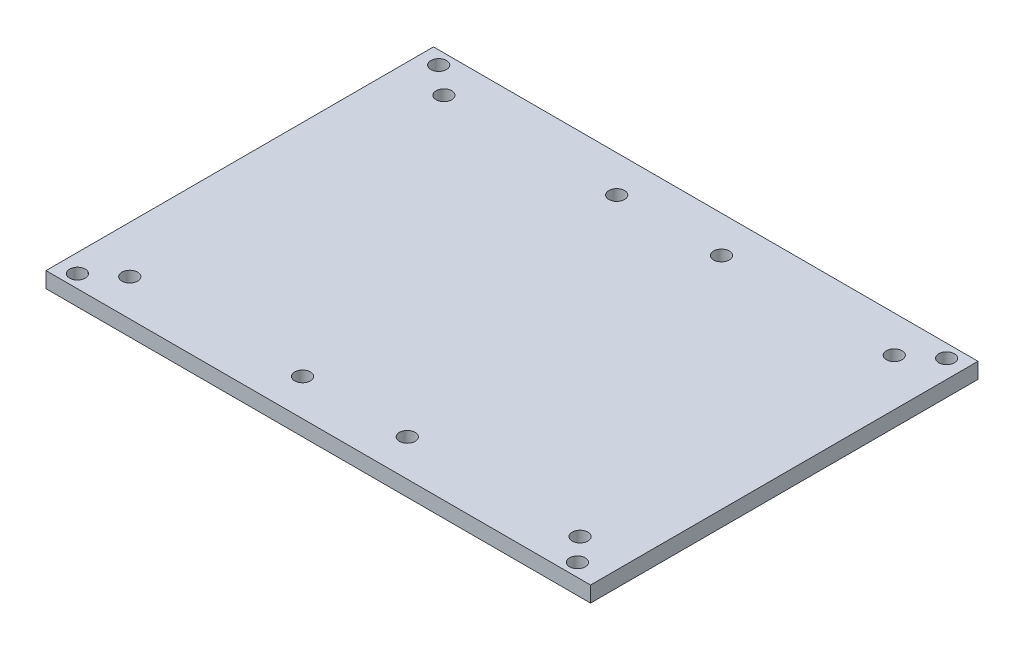
ISO-10303-21;
HEADER;
FILE_DESCRIPTION(('STEP AP214'),'2;1');
FILE_NAME('part.step','',(''),(''),'','','');
FILE_SCHEMA(('AUTOMOTIVE_DESIGN { 1 0 10303 214 1 1 1 1 }'));
ENDSEC;
DATA;
#1=APPLICATION_CONTEXT('core data for automotive mechanical design processes');
#2=APPLICATION_PROTOCOL_DEFINITION('international standard','automotive_design',2000,#1);
#3=PRODUCT_CONTEXT('',#1,'mechanical');
#4=PRODUCT('Part','Part','',(#3));
#5=PRODUCT_RELATED_PRODUCT_CATEGORY('part','',(#4));
#6=PRODUCT_DEFINITION_FORMATION('','',#4);
#7=PRODUCT_DEFINITION_CONTEXT('part definition',#1,'design');
#8=PRODUCT_DEFINITION('design','',#6,#7);
#9=PRODUCT_DEFINITION_SHAPE('','',#8);
#10=(LENGTH_UNIT() NAMED_UNIT(*) SI_UNIT(.MILLI.,.METRE.));
#11=(NAMED_UNIT(*) PLANE_ANGLE_UNIT() SI_UNIT($,.RADIAN.));
#12=(NAMED_UNIT(*) SI_UNIT($,.STERADIAN.) SOLID_ANGLE_UNIT());
#13=UNCERTAINTY_MEASURE_WITH_UNIT(LENGTH_MEASURE(1.E-05),#10,'distance_accuracy_value','');
#14=(GEOMETRIC_REPRESENTATION_CONTEXT(3) GLOBAL_UNCERTAINTY_ASSIGNED_CONTEXT((#13)) GLOBAL_UNIT_ASSIGNED_CONTEXT((#10,
#11,#12)) REPRESENTATION_CONTEXT('',''));
#15=CARTESIAN_POINT('',(0.,0.,0.));
#16=DIRECTION('',(0.,0.,1.));
#17=DIRECTION('',(1.,0.,0.));
#18=AXIS2_PLACEMENT_3D('',#15,#16,#17);
#19=CARTESIAN_POINT('',(52.,3.,-37.));
#20=DIRECTION('',(-1.,0.,0.));
#21=DIRECTION('',(0.,0.,1.));
#22=AXIS2_PLACEMENT_3D('',#19,#20,#21);
#23=PLANE('',#22);
#24=DIRECTION('',(0.,0.,-1.));
#25=VECTOR('',#24,1.);
#26=CARTESIAN_POINT('',(52.,0.,-37.));
#27=LINE('',#26,#25);
#28=CARTESIAN_POINT('',(52.,0.,37.));
#29=VERTEX_POINT('',#28);
#30=CARTESIAN_POINT('',(52.,0.,-37.));
#31=VERTEX_POINT('',#30);
#32=EDGE_CURVE('E96',#29,#31,#27,.T.);
#33=ORIENTED_EDGE('',*,*,#32,.T.);
#34=DIRECTION('',(0.,-1.,0.));
#35=VECTOR('',#34,1.);
#36=CARTESIAN_POINT('',(52.,3.,-37.));
#37=LINE('',#36,#35);
#38=CARTESIAN_POINT('',(52.,3.,-37.));
#39=VERTEX_POINT('',#38);
#40=EDGE_CURVE('E11',#39,#31,#37,.T.);
#41=ORIENTED_EDGE('',*,*,#40,.F.);
#42=DIRECTION('',(0.,0.,-1.));
#43=VECTOR('',#42,1.);
#44=CARTESIAN_POINT('',(52.,3.,-37.));
#45=LINE('',#44,#43);
#46=CARTESIAN_POINT('',(52.,3.,37.));
#47=VERTEX_POINT('',#46);
#48=EDGE_CURVE('E84',#47,#39,#45,.T.);
#49=ORIENTED_EDGE('',*,*,#48,.F.);
#50=DIRECTION('',(0.,-1.,0.));
#51=VECTOR('',#50,1.);
#52=CARTESIAN_POINT('',(52.,3.,37.));
#53=LINE('',#52,#51);
#54=EDGE_CURVE('E92',#47,#29,#53,.T.);
#55=ORIENTED_EDGE('',*,*,#54,.T.);
#56=EDGE_LOOP('',(#33,#41,#49,#55));
#57=FACE_BOUND('',#56,.T.);
#58=ADVANCED_FACE('F33',(#57),#23,.F.);
#59=CARTESIAN_POINT('',(-52.,3.,-37.));
#60=DIRECTION('',(0.,0.,1.));
#61=DIRECTION('',(1.,0.,0.));
#62=AXIS2_PLACEMENT_3D('',#59,#60,#61);
#63=PLANE('',#62);
#64=DIRECTION('',(-1.,0.,0.));
#65=VECTOR('',#64,1.);
#66=CARTESIAN_POINT('',(-52.,0.,-37.));
#67=LINE('',#66,#65);
#68=CARTESIAN_POINT('',(-52.,0.,-37.));
#69=VERTEX_POINT('',#68);
#70=EDGE_CURVE('E88',#31,#69,#67,.T.);
#71=ORIENTED_EDGE('',*,*,#70,.T.);
#72=DIRECTION('',(0.,-1.,0.));
#73=VECTOR('',#72,1.);
#74=CARTESIAN_POINT('',(-52.,3.,-37.));
#75=LINE('',#74,#73);
#76=CARTESIAN_POINT('',(-52.,3.,-37.));
#77=VERTEX_POINT('',#76);
#78=EDGE_CURVE('E41',#77,#69,#75,.T.);
#79=ORIENTED_EDGE('',*,*,#78,.F.);
#80=DIRECTION('',(-1.,0.,0.));
#81=VECTOR('',#80,1.);
#82=CARTESIAN_POINT('',(-52.,3.,-37.));
#83=LINE('',#82,#81);
#84=EDGE_CURVE('E79',#39,#77,#83,.T.);
#85=ORIENTED_EDGE('',*,*,#84,.F.);
#86=ORIENTED_EDGE('',*,*,#40,.T.);
#87=EDGE_LOOP('',(#71,#79,#85,#86));
#88=FACE_BOUND('',#87,.T.);
#89=ADVANCED_FACE('F87',(#88),#63,.F.);
#90=CARTESIAN_POINT('',(-52.,3.,-37.));
#91=DIRECTION('',(1.,0.,0.));
#92=DIRECTION('',(0.,0.,-1.));
#93=AXIS2_PLACEMENT_3D('',#90,#91,#92);
#94=PLANE('',#93);
#95=DIRECTION('',(0.,0.,1.));
#96=VECTOR('',#95,1.);
#97=CARTESIAN_POINT('',(-52.,0.,-37.));
#98=LINE('',#97,#96);
#99=CARTESIAN_POINT('',(-52.,0.,37.));
#100=VERTEX_POINT('',#99);
#101=EDGE_CURVE('E66',#69,#100,#98,.T.);
#102=ORIENTED_EDGE('',*,*,#101,.T.);
#103=DIRECTION('',(0.,-1.,0.));
#104=VECTOR('',#103,1.);
#105=CARTESIAN_POINT('',(-52.,3.,37.));
#106=LINE('',#105,#104);
#107=CARTESIAN_POINT('',(-52.,3.,37.));
#108=VERTEX_POINT('',#107);
#109=EDGE_CURVE('E89',#108,#100,#106,.T.);
#110=ORIENTED_EDGE('',*,*,#109,.F.);
#111=DIRECTION('',(0.,0.,1.));
#112=VECTOR('',#111,1.);
#113=CARTESIAN_POINT('',(-52.,3.,-37.));
#114=LINE('',#113,#112);
#115=EDGE_CURVE('E82',#77,#108,#114,.T.);
#116=ORIENTED_EDGE('',*,*,#115,.F.);
#117=ORIENTED_EDGE('',*,*,#78,.T.);
#118=EDGE_LOOP('',(#102,#110,#116,#117));
#119=FACE_BOUND('',#118,.T.);
#120=ADVANCED_FACE('F90',(#119),#94,.F.);
#121=CARTESIAN_POINT('',(-52.,3.,37.));
#122=DIRECTION('',(0.,0.,-1.));
#123=DIRECTION('',(-1.,0.,0.));
#124=AXIS2_PLACEMENT_3D('',#121,#122,#123);
#125=PLANE('',#124);
#126=DIRECTION('',(1.,0.,0.));
#127=VECTOR('',#126,1.);
#128=CARTESIAN_POINT('',(-52.,0.,37.));
#129=LINE('',#128,#127);
#130=EDGE_CURVE('E72',#100,#29,#129,.T.);
#131=ORIENTED_EDGE('',*,*,#130,.T.);
#132=ORIENTED_EDGE('',*,*,#54,.F.);
#133=DIRECTION('',(1.,0.,0.));
#134=VECTOR('',#133,1.);
#135=CARTESIAN_POINT('',(-52.,3.,37.));
#136=LINE('',#135,#134);
#137=EDGE_CURVE('E49',#108,#47,#136,.T.);
#138=ORIENTED_EDGE('',*,*,#137,.F.);
#139=ORIENTED_EDGE('',*,*,#109,.T.);
#140=EDGE_LOOP('',(#131,#132,#138,#139));
#141=FACE_BOUND('',#140,.T.);
#142=ADVANCED_FACE('F104',(#141),#125,.F.);
#143=CARTESIAN_POINT('',(0.,3.,0.));
#144=DIRECTION('',(0.,1.,0.));
#145=DIRECTION('',(0.,0.,1.));
#146=AXIS2_PLACEMENT_3D('',#143,#144,#145);
#147=PLANE('',#146);
#148=CARTESIAN_POINT('',(10.,3.,30.));
#149=DIRECTION('',(0.,1.,0.));
#150=DIRECTION('',(0.,0.,1.));
#151=AXIS2_PLACEMENT_3D('',#148,#149,#150);
#152=CIRCLE('',#151,1.5);
#153=CARTESIAN_POINT('',(10.,3.,31.5));
#154=VERTEX_POINT('',#153);
#155=EDGE_CURVE('E147',#154,#154,#152,.T.);
#156=ORIENTED_EDGE('',*,*,#155,.F.);
#157=EDGE_LOOP('',(#156));
#158=FACE_BOUND('',#157,.T.);
#159=CARTESIAN_POINT('',(43.,3.,-30.));
#160=DIRECTION('',(0.,1.,0.));
#161=DIRECTION('',(0.,0.,1.));
#162=AXIS2_PLACEMENT_3D('',#159,#160,#161);
#163=CIRCLE('',#162,1.5);
#164=CARTESIAN_POINT('',(43.,3.,-28.5));
#165=VERTEX_POINT('',#164);
#166=EDGE_CURVE('E140',#165,#165,#163,.T.);
#167=ORIENTED_EDGE('',*,*,#166,.F.);
#168=EDGE_LOOP('',(#167));
#169=FACE_BOUND('',#168,.T.);
#170=CARTESIAN_POINT('',(43.,3.,30.));
#171=DIRECTION('',(0.,1.,0.));
#172=DIRECTION('',(0.,0.,1.));
#173=AXIS2_PLACEMENT_3D('',#170,#171,#172);
#174=CIRCLE('',#173,1.5);
#175=CARTESIAN_POINT('',(43.,3.,31.5));
#176=VERTEX_POINT('',#175);
#177=EDGE_CURVE('E159',#176,#176,#174,.T.);
#178=ORIENTED_EDGE('',*,*,#177,.F.);
#179=EDGE_LOOP('',(#178));
#180=FACE_BOUND('',#179,.T.);
#181=CARTESIAN_POINT('',(48.5,3.,-34.5));
#182=DIRECTION('',(0.,1.,0.));
#183=DIRECTION('',(0.,0.,1.));
#184=AXIS2_PLACEMENT_3D('',#181,#182,#183);
#185=CIRCLE('',#184,1.5);
#186=CARTESIAN_POINT('',(48.5,3.,-33.));
#187=VERTEX_POINT('',#186);
#188=EDGE_CURVE('E152',#187,#187,#185,.T.);
#189=ORIENTED_EDGE('',*,*,#188,.F.);
#190=EDGE_LOOP('',(#189));
#191=FACE_BOUND('',#190,.T.);
#192=CARTESIAN_POINT('',(-43.,3.,30.));
#193=DIRECTION('',(0.,1.,0.));
#194=DIRECTION('',(0.,0.,1.));
#195=AXIS2_PLACEMENT_3D('',#192,#193,#194);
#196=CIRCLE('',#195,1.5);
#197=CARTESIAN_POINT('',(-43.,3.,31.5));
#198=VERTEX_POINT('',#197);
#199=EDGE_CURVE('E123',#198,#198,#196,.T.);
#200=ORIENTED_EDGE('',*,*,#199,.F.);
#201=EDGE_LOOP('',(#200));
#202=FACE_BOUND('',#201,.T.);
#203=CARTESIAN_POINT('',(10.,3.,-30.));
#204=DIRECTION('',(0.,1.,0.));
#205=DIRECTION('',(0.,0.,1.));
#206=AXIS2_PLACEMENT_3D('',#203,#204,#205);
#207=CIRCLE('',#206,1.5);
#208=CARTESIAN_POINT('',(10.,3.,-28.5));
#209=VERTEX_POINT('',#208);
#210=EDGE_CURVE('E116',#209,#209,#207,.T.);
#211=ORIENTED_EDGE('',*,*,#210,.F.);
#212=EDGE_LOOP('',(#211));
#213=FACE_BOUND('',#212,.T.);
#214=CARTESIAN_POINT('',(-10.,3.,-30.));
#215=DIRECTION('',(0.,1.,0.));
#216=DIRECTION('',(0.,0.,1.));
#217=AXIS2_PLACEMENT_3D('',#214,#215,#216);
#218=CIRCLE('',#217,1.5);
#219=CARTESIAN_POINT('',(-10.,3.,-28.5));
#220=VERTEX_POINT('',#219);
#221=EDGE_CURVE('E135',#220,#220,#218,.T.);
#222=ORIENTED_EDGE('',*,*,#221,.F.);
#223=EDGE_LOOP('',(#222));
#224=FACE_BOUND('',#223,.T.);
#225=CARTESIAN_POINT('',(-10.,3.,30.));
#226=DIRECTION('',(0.,1.,0.));
#227=DIRECTION('',(0.,0.,1.));
#228=AXIS2_PLACEMENT_3D('',#225,#226,#227);
#229=CIRCLE('',#228,1.5);
#230=CARTESIAN_POINT('',(-10.,3.,31.5));
#231=VERTEX_POINT('',#230);
#232=EDGE_CURVE('E128',#231,#231,#229,.T.);
#233=ORIENTED_EDGE('',*,*,#232,.F.);
#234=EDGE_LOOP('',(#233));
#235=FACE_BOUND('',#234,.T.);
#236=CARTESIAN_POINT('',(-48.5,3.,-34.5));
#237=DIRECTION('',(0.,1.,0.));
#238=DIRECTION('',(0.,0.,1.));
#239=AXIS2_PLACEMENT_3D('',#236,#237,#238);
#240=CIRCLE('',#239,1.5);
#241=CARTESIAN_POINT('',(-48.5,3.,-33.));
#242=VERTEX_POINT('',#241);
#243=EDGE_CURVE('E176',#242,#242,#240,.T.);
#244=ORIENTED_EDGE('',*,*,#243,.F.);
#245=EDGE_LOOP('',(#244));
#246=FACE_BOUND('',#245,.T.);
#247=CARTESIAN_POINT('',(-48.5,3.,34.5));
#248=DIRECTION('',(0.,1.,0.));
#249=DIRECTION('',(0.,0.,1.));
#250=AXIS2_PLACEMENT_3D('',#247,#248,#249);
#251=CIRCLE('',#250,1.5);
#252=CARTESIAN_POINT('',(-48.5,3.,36.));
#253=VERTEX_POINT('',#252);
#254=EDGE_CURVE('E170',#253,#253,#251,.T.);
#255=ORIENTED_EDGE('',*,*,#254,.F.);
#256=EDGE_LOOP('',(#255));
#257=FACE_BOUND('',#256,.T.);
#258=CARTESIAN_POINT('',(47.,3.,34.5));
#259=DIRECTION('',(0.,1.,0.));
#260=DIRECTION('',(0.,0.,1.));
#261=AXIS2_PLACEMENT_3D('',#258,#259,#260);
#262=CIRCLE('',#261,1.5);
#263=CARTESIAN_POINT('',(47.,3.,36.));
#264=VERTEX_POINT('',#263);
#265=EDGE_CURVE('E164',#264,#264,#262,.T.);
#266=ORIENTED_EDGE('',*,*,#265,.F.);
#267=EDGE_LOOP('',(#266));
#268=FACE_BOUND('',#267,.T.);
#269=CARTESIAN_POINT('',(-43.,3.,-30.));
#270=DIRECTION('',(0.,1.,0.));
#271=DIRECTION('',(0.,0.,1.));
#272=AXIS2_PLACEMENT_3D('',#269,#270,#271);
#273=CIRCLE('',#272,1.5);
#274=CARTESIAN_POINT('',(-43.,3.,-28.5));
#275=VERTEX_POINT('',#274);
#276=EDGE_CURVE('E110',#275,#275,#273,.T.);
#277=ORIENTED_EDGE('',*,*,#276,.F.);
#278=EDGE_LOOP('',(#277));
#279=FACE_BOUND('',#278,.T.);
#280=ORIENTED_EDGE('',*,*,#48,.T.);
#281=ORIENTED_EDGE('',*,*,#84,.T.);
#282=ORIENTED_EDGE('',*,*,#115,.T.);
#283=ORIENTED_EDGE('',*,*,#137,.T.);
#284=EDGE_LOOP('',(#280,#281,#282,#283));
#285=FACE_BOUND('',#284,.T.);
#286=ADVANCED_FACE('F80',(#158,#169,#180,#191,#202,#213,#224,#235,#246,#257,#268,#279,#285),
#147,.T.);
#287=CARTESIAN_POINT('',(0.,0.,0.));
#288=DIRECTION('',(0.,1.,0.));
#289=DIRECTION('',(0.,0.,1.));
#290=AXIS2_PLACEMENT_3D('',#287,#288,#289);
#291=PLANE('',#290);
#292=CARTESIAN_POINT('',(10.,0.,30.));
#293=DIRECTION('',(0.,1.,0.));
#294=DIRECTION('',(0.,0.,1.));
#295=AXIS2_PLACEMENT_3D('',#292,#293,#294);
#296=CIRCLE('',#295,1.5);
#297=CARTESIAN_POINT('',(10.,0.,31.5));
#298=VERTEX_POINT('',#297);
#299=EDGE_CURVE('E132',#298,#298,#296,.T.);
#300=ORIENTED_EDGE('',*,*,#299,.T.);
#301=EDGE_LOOP('',(#300));
#302=FACE_BOUND('',#301,.T.);
#303=CARTESIAN_POINT('',(43.,0.,-30.));
#304=DIRECTION('',(0.,1.,0.));
#305=DIRECTION('',(0.,0.,1.));
#306=AXIS2_PLACEMENT_3D('',#303,#304,#305);
#307=CIRCLE('',#306,1.5);
#308=CARTESIAN_POINT('',(43.,0.,-28.5));
#309=VERTEX_POINT('',#308);
#310=EDGE_CURVE('E143',#309,#309,#307,.T.);
#311=ORIENTED_EDGE('',*,*,#310,.T.);
#312=EDGE_LOOP('',(#311));
#313=FACE_BOUND('',#312,.T.);
#314=CARTESIAN_POINT('',(43.,0.,30.));
#315=DIRECTION('',(0.,1.,0.));
#316=DIRECTION('',(0.,0.,1.));
#317=AXIS2_PLACEMENT_3D('',#314,#315,#316);
#318=CIRCLE('',#317,1.5);
#319=CARTESIAN_POINT('',(43.,0.,31.5));
#320=VERTEX_POINT('',#319);
#321=EDGE_CURVE('E144',#320,#320,#318,.T.);
#322=ORIENTED_EDGE('',*,*,#321,.T.);
#323=EDGE_LOOP('',(#322));
#324=FACE_BOUND('',#323,.T.);
#325=CARTESIAN_POINT('',(48.5,0.,-34.5));
#326=DIRECTION('',(0.,1.,0.));
#327=DIRECTION('',(0.,0.,1.));
#328=AXIS2_PLACEMENT_3D('',#325,#326,#327);
#329=CIRCLE('',#328,1.5);
#330=CARTESIAN_POINT('',(48.5,0.,-33.));
#331=VERTEX_POINT('',#330);
#332=EDGE_CURVE('E155',#331,#331,#329,.T.);
#333=ORIENTED_EDGE('',*,*,#332,.T.);
#334=EDGE_LOOP('',(#333));
#335=FACE_BOUND('',#334,.T.);
#336=CARTESIAN_POINT('',(-43.,0.,30.));
#337=DIRECTION('',(0.,1.,0.));
#338=DIRECTION('',(0.,0.,1.));
#339=AXIS2_PLACEMENT_3D('',#336,#337,#338);
#340=CIRCLE('',#339,1.5);
#341=CARTESIAN_POINT('',(-43.,0.,31.5));
#342=VERTEX_POINT('',#341);
#343=EDGE_CURVE('E113',#342,#342,#340,.T.);
#344=ORIENTED_EDGE('',*,*,#343,.T.);
#345=EDGE_LOOP('',(#344));
#346=FACE_BOUND('',#345,.T.);
#347=CARTESIAN_POINT('',(10.,0.,-30.));
#348=DIRECTION('',(0.,1.,0.));
#349=DIRECTION('',(0.,0.,1.));
#350=AXIS2_PLACEMENT_3D('',#347,#348,#349);
#351=CIRCLE('',#350,1.5);
#352=CARTESIAN_POINT('',(10.,0.,-28.5));
#353=VERTEX_POINT('',#352);
#354=EDGE_CURVE('E119',#353,#353,#351,.T.);
#355=ORIENTED_EDGE('',*,*,#354,.T.);
#356=EDGE_LOOP('',(#355));
#357=FACE_BOUND('',#356,.T.);
#358=CARTESIAN_POINT('',(-10.,0.,-30.));
#359=DIRECTION('',(0.,1.,0.));
#360=DIRECTION('',(0.,0.,1.));
#361=AXIS2_PLACEMENT_3D('',#358,#359,#360);
#362=CIRCLE('',#361,1.5);
#363=CARTESIAN_POINT('',(-10.,0.,-28.5));
#364=VERTEX_POINT('',#363);
#365=EDGE_CURVE('E120',#364,#364,#362,.T.);
#366=ORIENTED_EDGE('',*,*,#365,.T.);
#367=EDGE_LOOP('',(#366));
#368=FACE_BOUND('',#367,.T.);
#369=CARTESIAN_POINT('',(-10.,0.,30.));
#370=DIRECTION('',(0.,1.,0.));
#371=DIRECTION('',(0.,0.,1.));
#372=AXIS2_PLACEMENT_3D('',#369,#370,#371);
#373=CIRCLE('',#372,1.5);
#374=CARTESIAN_POINT('',(-10.,0.,31.5));
#375=VERTEX_POINT('',#374);
#376=EDGE_CURVE('E131',#375,#375,#373,.T.);
#377=ORIENTED_EDGE('',*,*,#376,.T.);
#378=EDGE_LOOP('',(#377));
#379=FACE_BOUND('',#378,.T.);
#380=CARTESIAN_POINT('',(-48.5,0.,-34.5));
#381=DIRECTION('',(0.,1.,0.));
#382=DIRECTION('',(0.,0.,1.));
#383=AXIS2_PLACEMENT_3D('',#380,#381,#382);
#384=CIRCLE('',#383,1.5);
#385=CARTESIAN_POINT('',(-48.5,0.,-33.));
#386=VERTEX_POINT('',#385);
#387=EDGE_CURVE('E156',#386,#386,#384,.T.);
#388=ORIENTED_EDGE('',*,*,#387,.T.);
#389=EDGE_LOOP('',(#388));
#390=FACE_BOUND('',#389,.T.);
#391=CARTESIAN_POINT('',(-48.5,0.,34.5));
#392=DIRECTION('',(0.,1.,0.));
#393=DIRECTION('',(0.,0.,1.));
#394=AXIS2_PLACEMENT_3D('',#391,#392,#393);
#395=CIRCLE('',#394,1.5);
#396=CARTESIAN_POINT('',(-48.5,0.,36.));
#397=VERTEX_POINT('',#396);
#398=EDGE_CURVE('E173',#397,#397,#395,.T.);
#399=ORIENTED_EDGE('',*,*,#398,.T.);
#400=EDGE_LOOP('',(#399));
#401=FACE_BOUND('',#400,.T.);
#402=CARTESIAN_POINT('',(47.,0.,34.5));
#403=DIRECTION('',(0.,1.,0.));
#404=DIRECTION('',(0.,0.,1.));
#405=AXIS2_PLACEMENT_3D('',#402,#403,#404);
#406=CIRCLE('',#405,1.5);
#407=CARTESIAN_POINT('',(47.,0.,36.));
#408=VERTEX_POINT('',#407);
#409=EDGE_CURVE('E167',#408,#408,#406,.T.);
#410=ORIENTED_EDGE('',*,*,#409,.T.);
#411=EDGE_LOOP('',(#410));
#412=FACE_BOUND('',#411,.T.);
#413=CARTESIAN_POINT('',(-43.,0.,-30.));
#414=DIRECTION('',(0.,1.,0.));
#415=DIRECTION('',(0.,0.,1.));
#416=AXIS2_PLACEMENT_3D('',#413,#414,#415);
#417=CIRCLE('',#416,1.5);
#418=CARTESIAN_POINT('',(-43.,0.,-28.5));
#419=VERTEX_POINT('',#418);
#420=EDGE_CURVE('E99',#419,#419,#417,.T.);
#421=ORIENTED_EDGE('',*,*,#420,.T.);
#422=EDGE_LOOP('',(#421));
#423=FACE_BOUND('',#422,.T.);
#424=ORIENTED_EDGE('',*,*,#32,.F.);
#425=ORIENTED_EDGE('',*,*,#130,.F.);
#426=ORIENTED_EDGE('',*,*,#101,.F.);
#427=ORIENTED_EDGE('',*,*,#70,.F.);
#428=EDGE_LOOP('',(#424,#425,#426,#427));
#429=FACE_BOUND('',#428,.T.);
#430=ADVANCED_FACE('F107',(#302,#313,#324,#335,#346,#357,#368,#379,#390,#401,#412,#423,#429),
#291,.F.);
#431=CARTESIAN_POINT('',(-43.,0.,-30.));
#432=DIRECTION('',(0.,1.,0.));
#433=DIRECTION('',(0.,0.,1.));
#434=AXIS2_PLACEMENT_3D('',#431,#432,#433);
#435=CYLINDRICAL_SURFACE('',#434,1.5);
#436=ORIENTED_EDGE('',*,*,#420,.F.);
#437=EDGE_LOOP('',(#436));
#438=FACE_BOUND('',#437,.T.);
#439=ORIENTED_EDGE('',*,*,#276,.T.);
#440=EDGE_LOOP('',(#439));
#441=FACE_BOUND('',#440,.T.);
#442=ADVANCED_FACE('F202',(#438,#441),#435,.F.);
#443=CARTESIAN_POINT('',(47.,0.,34.5));
#444=DIRECTION('',(0.,1.,0.));
#445=DIRECTION('',(0.,0.,1.));
#446=AXIS2_PLACEMENT_3D('',#443,#444,#445);
#447=CYLINDRICAL_SURFACE('',#446,1.5);
#448=ORIENTED_EDGE('',*,*,#409,.F.);
#449=EDGE_LOOP('',(#448));
#450=FACE_BOUND('',#449,.T.);
#451=ORIENTED_EDGE('',*,*,#265,.T.);
#452=EDGE_LOOP('',(#451));
#453=FACE_BOUND('',#452,.T.);
#454=ADVANCED_FACE('F204',(#450,#453),#447,.F.);
#455=CARTESIAN_POINT('',(-48.5,0.,34.5));
#456=DIRECTION('',(0.,1.,0.));
#457=DIRECTION('',(0.,0.,1.));
#458=AXIS2_PLACEMENT_3D('',#455,#456,#457);
#459=CYLINDRICAL_SURFACE('',#458,1.5);
#460=ORIENTED_EDGE('',*,*,#398,.F.);
#461=EDGE_LOOP('',(#460));
#462=FACE_BOUND('',#461,.T.);
#463=ORIENTED_EDGE('',*,*,#254,.T.);
#464=EDGE_LOOP('',(#463));
#465=FACE_BOUND('',#464,.T.);
#466=ADVANCED_FACE('F188',(#462,#465),#459,.F.);
#467=CARTESIAN_POINT('',(-48.5,0.,-34.5));
#468=DIRECTION('',(0.,1.,0.));
#469=DIRECTION('',(0.,0.,1.));
#470=AXIS2_PLACEMENT_3D('',#467,#468,#469);
#471=CYLINDRICAL_SURFACE('',#470,1.5);
#472=ORIENTED_EDGE('',*,*,#387,.F.);
#473=EDGE_LOOP('',(#472));
#474=FACE_BOUND('',#473,.T.);
#475=ORIENTED_EDGE('',*,*,#243,.T.);
#476=EDGE_LOOP('',(#475));
#477=FACE_BOUND('',#476,.T.);
#478=ADVANCED_FACE('F184',(#474,#477),#471,.F.);
#479=CARTESIAN_POINT('',(-10.,0.,30.));
#480=DIRECTION('',(0.,1.,0.));
#481=DIRECTION('',(0.,0.,1.));
#482=AXIS2_PLACEMENT_3D('',#479,#480,#481);
#483=CYLINDRICAL_SURFACE('',#482,1.5);
#484=ORIENTED_EDGE('',*,*,#376,.F.);
#485=EDGE_LOOP('',(#484));
#486=FACE_BOUND('',#485,.T.);
#487=ORIENTED_EDGE('',*,*,#232,.T.);
#488=EDGE_LOOP('',(#487));
#489=FACE_BOUND('',#488,.T.);
#490=ADVANCED_FACE('F187',(#486,#489),#483,.F.);
#491=CARTESIAN_POINT('',(-10.,0.,-30.));
#492=DIRECTION('',(0.,1.,0.));
#493=DIRECTION('',(0.,0.,1.));
#494=AXIS2_PLACEMENT_3D('',#491,#492,#493);
#495=CYLINDRICAL_SURFACE('',#494,1.5);
#496=ORIENTED_EDGE('',*,*,#365,.F.);
#497=EDGE_LOOP('',(#496));
#498=FACE_BOUND('',#497,.T.);
#499=ORIENTED_EDGE('',*,*,#221,.T.);
#500=EDGE_LOOP('',(#499));
#501=FACE_BOUND('',#500,.T.);
#502=ADVANCED_FACE('F273',(#498,#501),#495,.F.);
#503=CARTESIAN_POINT('',(10.,0.,-30.));
#504=DIRECTION('',(0.,1.,0.));
#505=DIRECTION('',(0.,0.,1.));
#506=AXIS2_PLACEMENT_3D('',#503,#504,#505);
#507=CYLINDRICAL_SURFACE('',#506,1.5);
#508=ORIENTED_EDGE('',*,*,#354,.F.);
#509=EDGE_LOOP('',(#508));
#510=FACE_BOUND('',#509,.T.);
#511=ORIENTED_EDGE('',*,*,#210,.T.);
#512=EDGE_LOOP('',(#511));
#513=FACE_BOUND('',#512,.T.);
#514=ADVANCED_FACE('F283',(#510,#513),#507,.F.);
#515=CARTESIAN_POINT('',(-43.,0.,30.));
#516=DIRECTION('',(0.,1.,0.));
#517=DIRECTION('',(0.,0.,1.));
#518=AXIS2_PLACEMENT_3D('',#515,#516,#517);
#519=CYLINDRICAL_SURFACE('',#518,1.5);
#520=ORIENTED_EDGE('',*,*,#343,.F.);
#521=EDGE_LOOP('',(#520));
#522=FACE_BOUND('',#521,.T.);
#523=ORIENTED_EDGE('',*,*,#199,.T.);
#524=EDGE_LOOP('',(#523));
#525=FACE_BOUND('',#524,.T.);
#526=ADVANCED_FACE('F293',(#522,#525),#519,.F.);
#527=CARTESIAN_POINT('',(48.5,0.,-34.5));
#528=DIRECTION('',(0.,1.,0.));
#529=DIRECTION('',(0.,0.,1.));
#530=AXIS2_PLACEMENT_3D('',#527,#528,#529);
#531=CYLINDRICAL_SURFACE('',#530,1.5);
#532=ORIENTED_EDGE('',*,*,#332,.F.);
#533=EDGE_LOOP('',(#532));
#534=FACE_BOUND('',#533,.T.);
#535=ORIENTED_EDGE('',*,*,#188,.T.);
#536=EDGE_LOOP('',(#535));
#537=FACE_BOUND('',#536,.T.);
#538=ADVANCED_FACE('F302',(#534,#537),#531,.F.);
#539=CARTESIAN_POINT('',(43.,0.,30.));
#540=DIRECTION('',(0.,1.,0.));
#541=DIRECTION('',(0.,0.,1.));
#542=AXIS2_PLACEMENT_3D('',#539,#540,#541);
#543=CYLINDRICAL_SURFACE('',#542,1.5);
#544=ORIENTED_EDGE('',*,*,#321,.F.);
#545=EDGE_LOOP('',(#544));
#546=FACE_BOUND('',#545,.T.);
#547=ORIENTED_EDGE('',*,*,#177,.T.);
#548=EDGE_LOOP('',(#547));
#549=FACE_BOUND('',#548,.T.);
#550=ADVANCED_FACE('F312',(#546,#549),#543,.F.);
#551=CARTESIAN_POINT('',(43.,0.,-30.));
#552=DIRECTION('',(0.,1.,0.));
#553=DIRECTION('',(0.,0.,1.));
#554=AXIS2_PLACEMENT_3D('',#551,#552,#553);
#555=CYLINDRICAL_SURFACE('',#554,1.5);
#556=ORIENTED_EDGE('',*,*,#310,.F.);
#557=EDGE_LOOP('',(#556));
#558=FACE_BOUND('',#557,.T.);
#559=ORIENTED_EDGE('',*,*,#166,.T.);
#560=EDGE_LOOP('',(#559));
#561=FACE_BOUND('',#560,.T.);
#562=ADVANCED_FACE('F322',(#558,#561),#555,.F.);
#563=CARTESIAN_POINT('',(10.,0.,30.));
#564=DIRECTION('',(0.,1.,0.));
#565=DIRECTION('',(0.,0.,1.));
#566=AXIS2_PLACEMENT_3D('',#563,#564,#565);
#567=CYLINDRICAL_SURFACE('',#566,1.5);
#568=ORIENTED_EDGE('',*,*,#299,.F.);
#569=EDGE_LOOP('',(#568));
#570=FACE_BOUND('',#569,.T.);
#571=ORIENTED_EDGE('',*,*,#155,.T.);
#572=EDGE_LOOP('',(#571));
#573=FACE_BOUND('',#572,.T.);
#574=ADVANCED_FACE('F332',(#570,#573),#567,.F.);
#575=CLOSED_SHELL('',(#58,#89,#120,#142,#286,#430,#442,#454,#466,#478,#490,#502,#514,#526,#538,
#550,#562,#574));
#576=MANIFOLD_SOLID_BREP('B2',#575);
#577=ADVANCED_BREP_SHAPE_REPRESENTATION('',(#18,#576),#14);
#578=SHAPE_DEFINITION_REPRESENTATION(#9,#577);
ENDSEC;
END-ISO-10303-21;
